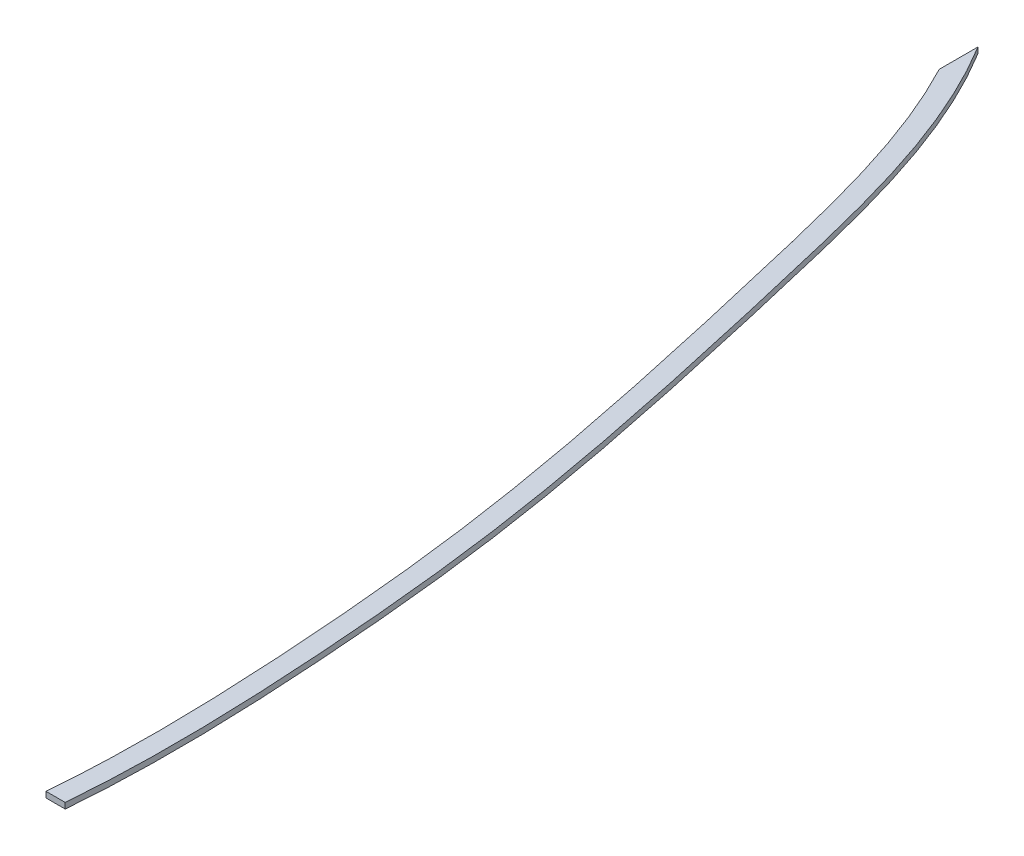
ISO-10303-21;
HEADER;
FILE_DESCRIPTION(('STEP AP214'),'2;1');
FILE_NAME('part.step','',(''),(''),'','','');
FILE_SCHEMA(('AUTOMOTIVE_DESIGN { 1 0 10303 214 1 1 1 1 }'));
ENDSEC;
DATA;
#1=APPLICATION_CONTEXT('core data for automotive mechanical design processes');
#2=APPLICATION_PROTOCOL_DEFINITION('international standard','automotive_design',2000,#1);
#3=PRODUCT_CONTEXT('',#1,'mechanical');
#4=PRODUCT('Part','Part','',(#3));
#5=PRODUCT_RELATED_PRODUCT_CATEGORY('part','',(#4));
#6=PRODUCT_DEFINITION_FORMATION('','',#4);
#7=PRODUCT_DEFINITION_CONTEXT('part definition',#1,'design');
#8=PRODUCT_DEFINITION('design','',#6,#7);
#9=PRODUCT_DEFINITION_SHAPE('','',#8);
#10=(LENGTH_UNIT() NAMED_UNIT(*) SI_UNIT(.MILLI.,.METRE.));
#11=(NAMED_UNIT(*) PLANE_ANGLE_UNIT() SI_UNIT($,.RADIAN.));
#12=(NAMED_UNIT(*) SI_UNIT($,.STERADIAN.) SOLID_ANGLE_UNIT());
#13=UNCERTAINTY_MEASURE_WITH_UNIT(LENGTH_MEASURE(1.E-05),#10,'distance_accuracy_value','');
#14=(GEOMETRIC_REPRESENTATION_CONTEXT(3) GLOBAL_UNCERTAINTY_ASSIGNED_CONTEXT((#13)) GLOBAL_UNIT_ASSIGNED_CONTEXT((#10,
#11,#12)) REPRESENTATION_CONTEXT('',''));
#15=CARTESIAN_POINT('',(0.,0.,0.));
#16=DIRECTION('',(0.,0.,1.));
#17=DIRECTION('',(1.,0.,0.));
#18=AXIS2_PLACEMENT_3D('',#15,#16,#17);
#19=CARTESIAN_POINT('',(1.51,96.98,0.));
#20=DIRECTION('',(-1.,0.,0.));
#21=DIRECTION('',(0.,0.,1.));
#22=AXIS2_PLACEMENT_3D('',#19,#20,#21);
#23=PLANE('',#22);
#24=DIRECTION('',(0.,0.,1.));
#25=VECTOR('',#24,1.);
#26=CARTESIAN_POINT('',(1.51,100.,0.));
#27=LINE('',#26,#25);
#28=CARTESIAN_POINT('',(1.51,100.,0.));
#29=VERTEX_POINT('',#28);
#30=CARTESIAN_POINT('',(1.50999999999997,100.,20.2423109756857));
#31=VERTEX_POINT('',#30);
#32=EDGE_CURVE('E118',#29,#31,#27,.T.);
#33=ORIENTED_EDGE('',*,*,#32,.F.);
#34=DIRECTION('',(0.,1.,0.));
#35=VECTOR('',#34,1.);
#36=CARTESIAN_POINT('',(1.51,96.98,0.));
#37=LINE('',#36,#35);
#38=CARTESIAN_POINT('',(1.51,96.98,0.));
#39=VERTEX_POINT('',#38);
#40=EDGE_CURVE('E11',#39,#29,#37,.T.);
#41=ORIENTED_EDGE('',*,*,#40,.F.);
#42=DIRECTION('',(0.,0.,1.));
#43=VECTOR('',#42,1.);
#44=CARTESIAN_POINT('',(1.51,96.98,0.));
#45=LINE('',#44,#43);
#46=CARTESIAN_POINT('',(1.50999999999997,96.98,20.2423109756857));
#47=VERTEX_POINT('',#46);
#48=EDGE_CURVE('E107',#39,#47,#45,.T.);
#49=ORIENTED_EDGE('',*,*,#48,.T.);
#50=DIRECTION('',(0.,1.,0.));
#51=VECTOR('',#50,1.);
#52=CARTESIAN_POINT('',(1.50999999999997,96.98,20.2423109756857));
#53=LINE('',#52,#51);
#54=EDGE_CURVE('E36',#47,#31,#53,.T.);
#55=ORIENTED_EDGE('',*,*,#54,.T.);
#56=EDGE_LOOP('',(#33,#41,#49,#55));
#57=FACE_BOUND('',#56,.T.);
#58=ADVANCED_FACE('F33',(#57),#23,.T.);
#59=CARTESIAN_POINT('',(1.51,96.98,0.));
#60=CARTESIAN_POINT('',(29.5843763953371,96.98,45.9199085804463));
#61=CARTESIAN_POINT('',(50.5617317335224,96.98,131.537674374278));
#62=CARTESIAN_POINT('',(77.5499834967741,96.98,249.48960784992));
#63=CARTESIAN_POINT('',(95.891946939166,96.98,349.466899637623));
#64=CARTESIAN_POINT('',(105.994111445149,96.98,459.744898329669));
#65=CARTESIAN_POINT('',(108.450715428122,96.98,536.753852140889));
#66=CARTESIAN_POINT('',(104.849487474012,96.98,579.999999592));
#67=B_SPLINE_CURVE_WITH_KNOTS('',3,(#59,#60,#61,#62,#63,#64,#65,#66),.UNSPECIFIED.,.F.,.F.,(4,1,
1,1,1,4),(0.,0.268699023149208,0.441133859224718,0.611992394224909,0.781089211090743,1.),.UNSPECIFIED.);
#68=DIRECTION('',(0.,1.,0.));
#69=VECTOR('',#68,1.);
#70=SURFACE_OF_LINEAR_EXTRUSION('',#67,#69);
#71=CARTESIAN_POINT('',(1.51,100.,0.));
#72=CARTESIAN_POINT('',(29.5843763953371,100.,45.9199085804463));
#73=CARTESIAN_POINT('',(50.5617317335224,100.,131.537674374278));
#74=CARTESIAN_POINT('',(77.5499834967741,100.,249.48960784992));
#75=CARTESIAN_POINT('',(95.891946939166,100.,349.466899637623));
#76=CARTESIAN_POINT('',(105.994111445149,100.,459.744898329669));
#77=CARTESIAN_POINT('',(108.450715428122,100.,536.753852140889));
#78=CARTESIAN_POINT('',(104.849487474012,100.,579.999999592));
#79=B_SPLINE_CURVE_WITH_KNOTS('',3,(#71,#72,#73,#74,#75,#76,#77,#78),.UNSPECIFIED.,.F.,.F.,(4,1,
1,1,1,4),(0.,0.268699023149208,0.441133859224718,0.611992394224909,0.781089211090743,1.),.UNSPECIFIED.);
#80=CARTESIAN_POINT('',(104.849487474012,100.,579.999999592));
#81=VERTEX_POINT('',#80);
#82=EDGE_CURVE('E69',#29,#81,#79,.T.);
#83=ORIENTED_EDGE('',*,*,#82,.T.);
#84=DIRECTION('',(0.,1.,0.));
#85=VECTOR('',#84,1.);
#86=CARTESIAN_POINT('',(104.849487474012,96.98,579.999999592));
#87=LINE('',#86,#85);
#88=CARTESIAN_POINT('',(104.849487474012,96.98,579.999999592));
#89=VERTEX_POINT('',#88);
#90=EDGE_CURVE('E42',#89,#81,#87,.T.);
#91=ORIENTED_EDGE('',*,*,#90,.F.);
#92=EDGE_CURVE('E91',#39,#89,#67,.T.);
#93=ORIENTED_EDGE('',*,*,#92,.F.);
#94=ORIENTED_EDGE('',*,*,#40,.T.);
#95=EDGE_LOOP('',(#83,#91,#93,#94));
#96=FACE_BOUND('',#95,.T.);
#97=ADVANCED_FACE('F124',(#96),#70,.F.);
#98=CARTESIAN_POINT('',(104.849487474012,96.98,579.999999592));
#99=DIRECTION('',(0.,0.,-1.));
#100=DIRECTION('',(-1.,0.,0.));
#101=AXIS2_PLACEMENT_3D('',#98,#99,#100);
#102=PLANE('',#101);
#103=DIRECTION('',(-1.,0.,0.));
#104=VECTOR('',#103,1.);
#105=CARTESIAN_POINT('',(104.849487474012,100.,579.999999592));
#106=LINE('',#105,#104);
#107=CARTESIAN_POINT('',(94.8148755738798,100.,579.999999592));
#108=VERTEX_POINT('',#107);
#109=EDGE_CURVE('E98',#81,#108,#106,.T.);
#110=ORIENTED_EDGE('',*,*,#109,.T.);
#111=DIRECTION('',(0.,1.,0.));
#112=VECTOR('',#111,1.);
#113=CARTESIAN_POINT('',(94.8148755738798,96.98,579.999999592));
#114=LINE('',#113,#112);
#115=CARTESIAN_POINT('',(94.8148755738798,96.98,579.999999592));
#116=VERTEX_POINT('',#115);
#117=EDGE_CURVE('E95',#116,#108,#114,.T.);
#118=ORIENTED_EDGE('',*,*,#117,.F.);
#119=DIRECTION('',(-1.,0.,0.));
#120=VECTOR('',#119,1.);
#121=CARTESIAN_POINT('',(104.849487474012,96.98,579.999999592));
#122=LINE('',#121,#120);
#123=EDGE_CURVE('E85',#89,#116,#122,.T.);
#124=ORIENTED_EDGE('',*,*,#123,.F.);
#125=ORIENTED_EDGE('',*,*,#90,.T.);
#126=EDGE_LOOP('',(#110,#118,#124,#125));
#127=FACE_BOUND('',#126,.T.);
#128=ADVANCED_FACE('F96',(#127),#102,.F.);
#129=CARTESIAN_POINT('',(94.8839799889905,96.98,579.1701438419));
#130=DIRECTION('',(-0.996550748501585,0.,-0.0829855750171705));
#131=DIRECTION('',(-0.0829855750171705,0.,0.996550748501585));
#132=AXIS2_PLACEMENT_3D('',#129,#130,#131);
#133=PLANE('',#132);
#134=DIRECTION('',(-0.0829855750171705,0.,0.996550748501585));
#135=VECTOR('',#134,1.);
#136=CARTESIAN_POINT('',(94.8839799889905,100.,579.1701438419));
#137=LINE('',#136,#135);
#138=CARTESIAN_POINT('',(94.8839799889905,100.,579.1701438419));
#139=VERTEX_POINT('',#138);
#140=EDGE_CURVE('E145',#139,#108,#137,.T.);
#141=ORIENTED_EDGE('',*,*,#140,.F.);
#142=DIRECTION('',(0.,1.,0.));
#143=VECTOR('',#142,1.);
#144=CARTESIAN_POINT('',(94.8839799889905,96.98,579.1701438419));
#145=LINE('',#144,#143);
#146=CARTESIAN_POINT('',(94.8839799889905,96.98,579.1701438419));
#147=VERTEX_POINT('',#146);
#148=EDGE_CURVE('E102',#147,#139,#145,.T.);
#149=ORIENTED_EDGE('',*,*,#148,.F.);
#150=DIRECTION('',(-0.0829855750171705,0.,0.996550748501585));
#151=VECTOR('',#150,1.);
#152=CARTESIAN_POINT('',(94.8839799889905,96.98,579.1701438419));
#153=LINE('',#152,#151);
#154=EDGE_CURVE('E90',#147,#116,#153,.T.);
#155=ORIENTED_EDGE('',*,*,#154,.T.);
#156=ORIENTED_EDGE('',*,*,#117,.T.);
#157=EDGE_LOOP('',(#141,#149,#155,#156));
#158=FACE_BOUND('',#157,.T.);
#159=ADVANCED_FACE('F104',(#158),#133,.T.);
#160=CARTESIAN_POINT('',(-7.01553435104833,96.98,5.21276859381828));
#161=CARTESIAN_POINT('',(-3.88341851597976,96.98,10.3359536566364));
#162=CARTESIAN_POINT('',(2.02833867643205,96.98,20.8194418754884));
#163=CARTESIAN_POINT('',(12.4377599466453,96.98,42.3797943162326));
#164=CARTESIAN_POINT('',(23.2060654276999,96.98,70.4620424289847));
#165=CARTESIAN_POINT('',(33.5480758713134,96.98,105.498995090439));
#166=CARTESIAN_POINT('',(40.8878474076881,96.98,135.419484837399));
#167=CARTESIAN_POINT('',(46.5564125926156,96.98,159.558389268549));
#168=CARTESIAN_POINT('',(52.1698197552208,96.98,183.656511355957));
#169=CARTESIAN_POINT('',(58.9990933919392,96.98,213.748587490116));
#170=CARTESIAN_POINT('',(66.7695063705093,96.98,249.891743152687));
#171=CARTESIAN_POINT('',(73.9740143347881,96.98,286.144876799434));
#172=CARTESIAN_POINT('',(80.3842770473371,96.98,322.497100307717));
#173=CARTESIAN_POINT('',(85.741554412753,96.98,358.920589589416));
#174=CARTESIAN_POINT('',(89.9051161586743,96.98,395.520906246752));
#175=CARTESIAN_POINT('',(93.0820257292089,96.98,432.287571962276));
#176=CARTESIAN_POINT('',(95.5159984834868,96.98,469.207045664385));
#177=CARTESIAN_POINT('',(97.044272033782,96.98,506.022429462863));
#178=CARTESIAN_POINT('',(97.1181545712954,96.98,542.712791998664));
#179=CARTESIAN_POINT('',(95.8949707946076,96.98,567.031140247943));
#180=CARTESIAN_POINT('',(94.8839799889905,96.98,579.1701438419));
#181=B_SPLINE_CURVE_WITH_KNOTS('',3,(#160,#161,#162,#163,#164,#165,#166,#167,#168,#169,#170,
#171,#172,#173,#174,#175,#176,#177,#178,#179,#180),.UNSPECIFIED.,.F.,.F.,(4,1,1,1,1,1,1,1,1,1,1,
1,1,1,1,1,1,1,4),(0.,0.03125,0.0625,0.125,0.1875,0.25,0.28125,0.3125,0.375,0.4375,0.5,0.5625,
0.625,0.6875,0.75,0.8125,0.875,0.9375,1.),.UNSPECIFIED.);
#182=DIRECTION('',(0.,1.,0.));
#183=VECTOR('',#182,1.);
#184=SURFACE_OF_LINEAR_EXTRUSION('',#181,#183);
#185=CARTESIAN_POINT('',(-7.01553435104833,100.,5.21276859381828));
#186=CARTESIAN_POINT('',(-3.88341851597976,100.,10.3359536566364));
#187=CARTESIAN_POINT('',(2.02833867643205,100.,20.8194418754884));
#188=CARTESIAN_POINT('',(12.4377599466453,100.,42.3797943162326));
#189=CARTESIAN_POINT('',(23.2060654276999,100.,70.4620424289847));
#190=CARTESIAN_POINT('',(33.5480758713134,100.,105.498995090439));
#191=CARTESIAN_POINT('',(40.8878474076881,100.,135.419484837399));
#192=CARTESIAN_POINT('',(46.5564125926156,100.,159.558389268549));
#193=CARTESIAN_POINT('',(52.1698197552208,100.,183.656511355957));
#194=CARTESIAN_POINT('',(58.9990933919392,100.,213.748587490116));
#195=CARTESIAN_POINT('',(66.7695063705093,100.,249.891743152687));
#196=CARTESIAN_POINT('',(73.9740143347881,100.,286.144876799434));
#197=CARTESIAN_POINT('',(80.3842770473371,100.,322.497100307717));
#198=CARTESIAN_POINT('',(85.741554412753,100.,358.920589589416));
#199=CARTESIAN_POINT('',(89.9051161586743,100.,395.520906246752));
#200=CARTESIAN_POINT('',(93.0820257292089,100.,432.287571962276));
#201=CARTESIAN_POINT('',(95.5159984834868,100.,469.207045664385));
#202=CARTESIAN_POINT('',(97.044272033782,100.,506.022429462863));
#203=CARTESIAN_POINT('',(97.1181545712954,100.,542.712791998664));
#204=CARTESIAN_POINT('',(95.8949707946076,100.,567.031140247943));
#205=CARTESIAN_POINT('',(94.8839799889905,100.,579.1701438419));
#206=B_SPLINE_CURVE_WITH_KNOTS('',3,(#185,#186,#187,#188,#189,#190,#191,#192,#193,#194,#195,
#196,#197,#198,#199,#200,#201,#202,#203,#204,#205),.UNSPECIFIED.,.F.,.F.,(4,1,1,1,1,1,1,1,1,1,1,
1,1,1,1,1,1,1,4),(0.,0.03125,0.0625,0.125,0.1875,0.25,0.28125,0.3125,0.375,0.4375,0.5,0.5625,
0.625,0.6875,0.75,0.8125,0.875,0.9375,1.),.UNSPECIFIED.);
#207=EDGE_CURVE('E144',#31,#139,#206,.T.);
#208=ORIENTED_EDGE('',*,*,#207,.F.);
#209=ORIENTED_EDGE('',*,*,#54,.F.);
#210=EDGE_CURVE('E105',#47,#147,#181,.T.);
#211=ORIENTED_EDGE('',*,*,#210,.T.);
#212=ORIENTED_EDGE('',*,*,#148,.T.);
#213=EDGE_LOOP('',(#208,#209,#211,#212));
#214=FACE_BOUND('',#213,.T.);
#215=ADVANCED_FACE('F133',(#214),#184,.T.);
#216=CARTESIAN_POINT('',(73.8416401261665,96.98,286.161391776357));
#217=DIRECTION('',(0.,1.,0.));
#218=DIRECTION('',(0.,0.,1.));
#219=AXIS2_PLACEMENT_3D('',#216,#217,#218);
#220=PLANE('',#219);
#221=ORIENTED_EDGE('',*,*,#48,.F.);
#222=ORIENTED_EDGE('',*,*,#92,.T.);
#223=ORIENTED_EDGE('',*,*,#123,.T.);
#224=ORIENTED_EDGE('',*,*,#154,.F.);
#225=ORIENTED_EDGE('',*,*,#210,.F.);
#226=EDGE_LOOP('',(#221,#222,#223,#224,#225));
#227=FACE_BOUND('',#226,.T.);
#228=ADVANCED_FACE('F88',(#227),#220,.F.);
#229=CARTESIAN_POINT('',(73.8416401261665,100.,286.161391776357));
#230=DIRECTION('',(0.,1.,0.));
#231=DIRECTION('',(0.,0.,1.));
#232=AXIS2_PLACEMENT_3D('',#229,#230,#231);
#233=PLANE('',#232);
#234=ORIENTED_EDGE('',*,*,#32,.T.);
#235=ORIENTED_EDGE('',*,*,#207,.T.);
#236=ORIENTED_EDGE('',*,*,#140,.T.);
#237=ORIENTED_EDGE('',*,*,#109,.F.);
#238=ORIENTED_EDGE('',*,*,#82,.F.);
#239=EDGE_LOOP('',(#234,#235,#236,#237,#238));
#240=FACE_BOUND('',#239,.T.);
#241=ADVANCED_FACE('F128',(#240),#233,.T.);
#242=CLOSED_SHELL('',(#58,#97,#128,#159,#215,#228,#241));
#243=MANIFOLD_SOLID_BREP('B2',#242);
#244=ADVANCED_BREP_SHAPE_REPRESENTATION('',(#18,#243),#14);
#245=SHAPE_DEFINITION_REPRESENTATION(#9,#244);
ENDSEC;
END-ISO-10303-21;
